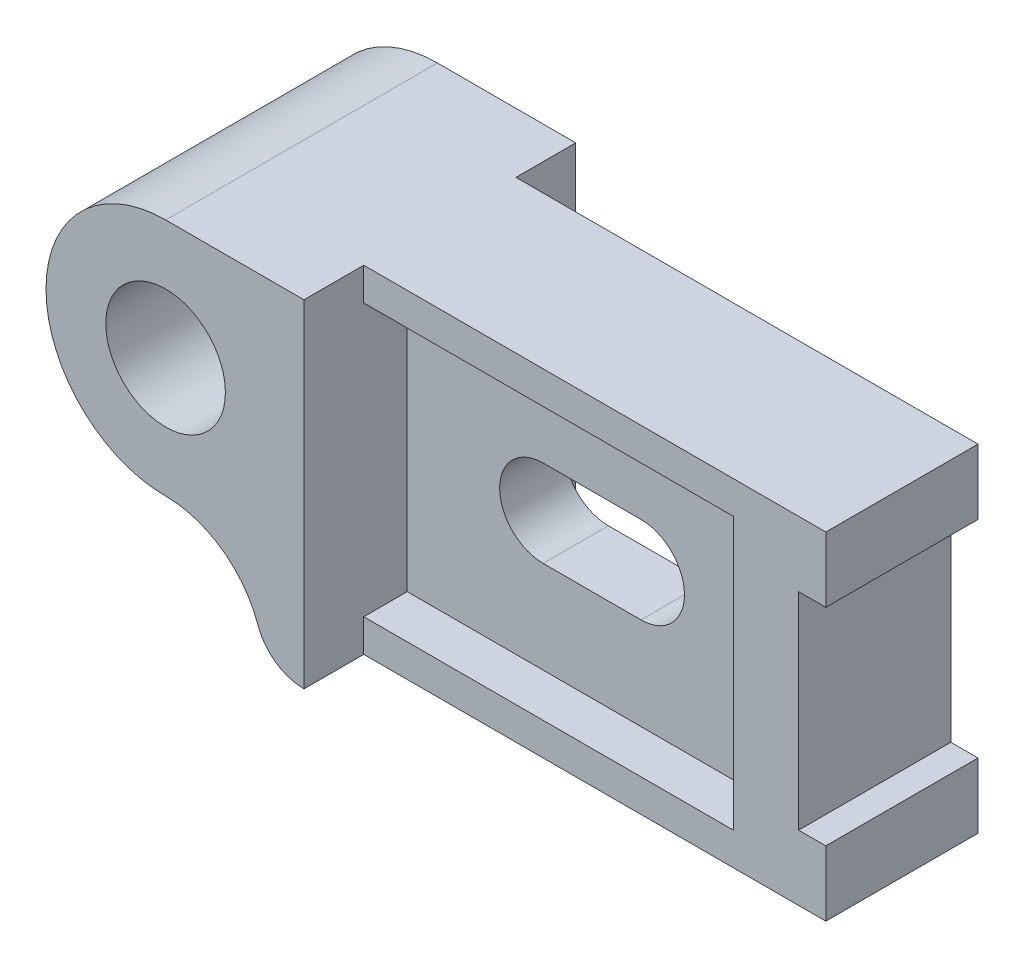
ISO-10303-21;
HEADER;
FILE_DESCRIPTION(('STEP AP214'),'2;1');
FILE_NAME('part.step','',(''),(''),'','','');
FILE_SCHEMA(('AUTOMOTIVE_DESIGN { 1 0 10303 214 1 1 1 1 }'));
ENDSEC;
DATA;
#1=APPLICATION_CONTEXT('core data for automotive mechanical design processes');
#2=APPLICATION_PROTOCOL_DEFINITION('international standard','automotive_design',2000,#1);
#3=PRODUCT_CONTEXT('',#1,'mechanical');
#4=PRODUCT('Part','Part','',(#3));
#5=PRODUCT_RELATED_PRODUCT_CATEGORY('part','',(#4));
#6=PRODUCT_DEFINITION_FORMATION('','',#4);
#7=PRODUCT_DEFINITION_CONTEXT('part definition',#1,'design');
#8=PRODUCT_DEFINITION('design','',#6,#7);
#9=PRODUCT_DEFINITION_SHAPE('','',#8);
#10=(LENGTH_UNIT() NAMED_UNIT(*) SI_UNIT(.MILLI.,.METRE.));
#11=(NAMED_UNIT(*) PLANE_ANGLE_UNIT() SI_UNIT($,.RADIAN.));
#12=(NAMED_UNIT(*) SI_UNIT($,.STERADIAN.) SOLID_ANGLE_UNIT());
#13=UNCERTAINTY_MEASURE_WITH_UNIT(LENGTH_MEASURE(1.E-05),#10,'distance_accuracy_value','');
#14=(GEOMETRIC_REPRESENTATION_CONTEXT(3) GLOBAL_UNCERTAINTY_ASSIGNED_CONTEXT((#13)) GLOBAL_UNIT_ASSIGNED_CONTEXT((#10,
#11,#12)) REPRESENTATION_CONTEXT('',''));
#15=CARTESIAN_POINT('',(0.,0.,0.));
#16=DIRECTION('',(0.,0.,1.));
#17=DIRECTION('',(1.,0.,0.));
#18=AXIS2_PLACEMENT_3D('',#15,#16,#17);
#19=CARTESIAN_POINT('',(93.4536598156302,16.,-19.));
#20=DIRECTION('',(0.,0.,-1.));
#21=DIRECTION('',(0.,1.,0.));
#22=AXIS2_PLACEMENT_3D('',#19,#20,#21);
#23=PLANE('',#22);
#24=DIRECTION('',(0.,-1.,0.));
#25=VECTOR('',#24,1.);
#26=CARTESIAN_POINT('',(25.4536598156302,16.,-19.));
#27=LINE('',#26,#25);
#28=CARTESIAN_POINT('',(25.4536598156302,16.,-19.));
#29=VERTEX_POINT('',#28);
#30=CARTESIAN_POINT('',(25.4536598156302,-34.,-19.));
#31=VERTEX_POINT('',#30);
#32=EDGE_CURVE('E270',#29,#31,#27,.T.);
#33=ORIENTED_EDGE('',*,*,#32,.T.);
#34=DIRECTION('',(-1.,0.,0.));
#35=VECTOR('',#34,1.);
#36=CARTESIAN_POINT('',(93.4536598156302,-34.,-19.));
#37=LINE('',#36,#35);
#38=CARTESIAN_POINT('',(93.4536598156302,-34.,-19.));
#39=VERTEX_POINT('',#38);
#40=EDGE_CURVE('E291',#39,#31,#37,.T.);
#41=ORIENTED_EDGE('',*,*,#40,.F.);
#42=DIRECTION('',(0.,-1.,0.));
#43=VECTOR('',#42,1.);
#44=CARTESIAN_POINT('',(93.4536598156302,16.,-19.));
#45=LINE('',#44,#43);
#46=CARTESIAN_POINT('',(93.4536598156302,16.,-19.));
#47=VERTEX_POINT('',#46);
#48=EDGE_CURVE('E275',#47,#39,#45,.T.);
#49=ORIENTED_EDGE('',*,*,#48,.F.);
#50=DIRECTION('',(-1.,0.,0.));
#51=VECTOR('',#50,1.);
#52=CARTESIAN_POINT('',(93.4536598156302,16.,-19.));
#53=LINE('',#52,#51);
#54=EDGE_CURVE('E282',#47,#29,#53,.T.);
#55=ORIENTED_EDGE('',*,*,#54,.T.);
#56=EDGE_LOOP('',(#33,#41,#49,#55));
#57=FACE_BOUND('',#56,.T.);
#58=CARTESIAN_POINT('',(50.4536598156302,-9.,-19.));
#59=DIRECTION('',(0.,0.,1.));
#60=DIRECTION('',(1.,0.,0.));
#61=AXIS2_PLACEMENT_3D('',#58,#59,#60);
#62=CIRCLE('',#61,8.);
#63=CARTESIAN_POINT('',(50.4536598156302,-0.999999999999998,-19.));
#64=VERTEX_POINT('',#63);
#65=CARTESIAN_POINT('',(50.4536598156302,-17.,-19.));
#66=VERTEX_POINT('',#65);
#67=EDGE_CURVE('E210',#64,#66,#62,.T.);
#68=ORIENTED_EDGE('',*,*,#67,.F.);
#69=DIRECTION('',(-1.,0.,0.));
#70=VECTOR('',#69,1.);
#71=CARTESIAN_POINT('',(50.4536598156302,-0.999999999999998,-19.));
#72=LINE('',#71,#70);
#73=CARTESIAN_POINT('',(68.4536598156302,-0.999999999999998,-19.));
#74=VERTEX_POINT('',#73);
#75=EDGE_CURVE('E207',#74,#64,#72,.T.);
#76=ORIENTED_EDGE('',*,*,#75,.F.);
#77=CARTESIAN_POINT('',(68.4536598156302,-9.,-19.));
#78=DIRECTION('',(0.,0.,1.));
#79=DIRECTION('',(1.,0.,0.));
#80=AXIS2_PLACEMENT_3D('',#77,#78,#79);
#81=CIRCLE('',#80,8.);
#82=CARTESIAN_POINT('',(68.4536598156302,-17.,-19.));
#83=VERTEX_POINT('',#82);
#84=EDGE_CURVE('E48',#83,#74,#81,.T.);
#85=ORIENTED_EDGE('',*,*,#84,.F.);
#86=DIRECTION('',(1.,0.,0.));
#87=VECTOR('',#86,1.);
#88=CARTESIAN_POINT('',(50.4536598156302,-17.,-19.));
#89=LINE('',#88,#87);
#90=EDGE_CURVE('E203',#66,#83,#89,.T.);
#91=ORIENTED_EDGE('',*,*,#90,.F.);
#92=EDGE_LOOP('',(#68,#76,#85,#91));
#93=FACE_BOUND('',#92,.T.);
#94=ADVANCED_FACE('F33',(#57,#93),#23,.F.);
#95=CARTESIAN_POINT('',(105.45365981563,0.,0.));
#96=DIRECTION('',(1.,0.,0.));
#97=DIRECTION('',(0.,0.,-1.));
#98=AXIS2_PLACEMENT_3D('',#95,#96,#97);
#99=PLANE('',#98);
#100=DIRECTION('',(0.,-1.,0.));
#101=VECTOR('',#100,1.);
#102=CARTESIAN_POINT('',(105.45365981563,22.,-11.));
#103=LINE('',#102,#101);
#104=CARTESIAN_POINT('',(105.45365981563,10.,-11.));
#105=VERTEX_POINT('',#104);
#106=CARTESIAN_POINT('',(105.45365981563,-28.,-11.));
#107=VERTEX_POINT('',#106);
#108=EDGE_CURVE('E264',#105,#107,#103,.T.);
#109=ORIENTED_EDGE('',*,*,#108,.T.);
#110=DIRECTION('',(0.,0.,1.));
#111=VECTOR('',#110,1.);
#112=CARTESIAN_POINT('',(105.45365981563,-28.,-11.));
#113=LINE('',#112,#111);
#114=CARTESIAN_POINT('',(105.45365981563,-28.,-39.));
#115=VERTEX_POINT('',#114);
#116=EDGE_CURVE('E223',#115,#107,#113,.T.);
#117=ORIENTED_EDGE('',*,*,#116,.F.);
#118=DIRECTION('',(0.,1.,0.));
#119=VECTOR('',#118,1.);
#120=CARTESIAN_POINT('',(105.45365981563,22.,-39.));
#121=LINE('',#120,#119);
#122=CARTESIAN_POINT('',(105.45365981563,10.,-39.));
#123=VERTEX_POINT('',#122);
#124=EDGE_CURVE('E267',#115,#123,#121,.T.);
#125=ORIENTED_EDGE('',*,*,#124,.T.);
#126=DIRECTION('',(0.,0.,-1.));
#127=VECTOR('',#126,1.);
#128=CARTESIAN_POINT('',(105.45365981563,10.,-11.));
#129=LINE('',#128,#127);
#130=EDGE_CURVE('E243',#105,#123,#129,.T.);
#131=ORIENTED_EDGE('',*,*,#130,.F.);
#132=EDGE_LOOP('',(#109,#117,#125,#131));
#133=FACE_BOUND('',#132,.T.);
#134=ADVANCED_FACE('F414',(#133),#99,.T.);
#135=CARTESIAN_POINT('',(25.4536598156302,22.,-50.));
#136=DIRECTION('',(1.,0.,0.));
#137=DIRECTION('',(0.,0.,-1.));
#138=AXIS2_PLACEMENT_3D('',#135,#136,#137);
#139=PLANE('',#138);
#140=DIRECTION('',(0.,0.,1.));
#141=VECTOR('',#140,1.);
#142=CARTESIAN_POINT('',(25.4536598156302,-34.,-11.));
#143=LINE('',#142,#141);
#144=CARTESIAN_POINT('',(25.4536598156302,-34.,-11.));
#145=VERTEX_POINT('',#144);
#146=EDGE_CURVE('E305',#31,#145,#143,.T.);
#147=ORIENTED_EDGE('',*,*,#146,.F.);
#148=ORIENTED_EDGE('',*,*,#32,.F.);
#149=DIRECTION('',(0.,0.,-1.));
#150=VECTOR('',#149,1.);
#151=CARTESIAN_POINT('',(25.4536598156302,16.,-11.));
#152=LINE('',#151,#150);
#153=CARTESIAN_POINT('',(25.4536598156302,16.,-11.));
#154=VERTEX_POINT('',#153);
#155=EDGE_CURVE('E329',#154,#29,#152,.T.);
#156=ORIENTED_EDGE('',*,*,#155,.F.);
#157=DIRECTION('',(0.,-1.,0.));
#158=VECTOR('',#157,1.);
#159=CARTESIAN_POINT('',(25.4536598156302,22.,-11.));
#160=LINE('',#159,#158);
#161=CARTESIAN_POINT('',(25.4536598156302,22.,-11.));
#162=VERTEX_POINT('',#161);
#163=EDGE_CURVE('E320',#162,#154,#160,.T.);
#164=ORIENTED_EDGE('',*,*,#163,.F.);
#165=DIRECTION('',(0.,0.,1.));
#166=VECTOR('',#165,1.);
#167=CARTESIAN_POINT('',(25.4536598156302,22.,-50.));
#168=LINE('',#167,#166);
#169=CARTESIAN_POINT('',(25.4536598156302,22.,0.));
#170=VERTEX_POINT('',#169);
#171=EDGE_CURVE('E387',#162,#170,#168,.T.);
#172=ORIENTED_EDGE('',*,*,#171,.T.);
#173=DIRECTION('',(0.,1.,0.));
#174=VECTOR('',#173,1.);
#175=CARTESIAN_POINT('',(25.4536598156302,22.,0.));
#176=LINE('',#175,#174);
#177=CARTESIAN_POINT('',(25.4536598156302,-40.,0.));
#178=VERTEX_POINT('',#177);
#179=EDGE_CURVE('E378',#178,#170,#176,.T.);
#180=ORIENTED_EDGE('',*,*,#179,.F.);
#181=DIRECTION('',(0.,0.,1.));
#182=VECTOR('',#181,1.);
#183=CARTESIAN_POINT('',(25.4536598156302,-40.,-50.));
#184=LINE('',#183,#182);
#185=CARTESIAN_POINT('',(25.4536598156302,-40.,-11.));
#186=VERTEX_POINT('',#185);
#187=EDGE_CURVE('E391',#186,#178,#184,.T.);
#188=ORIENTED_EDGE('',*,*,#187,.F.);
#189=DIRECTION('',(0.,-1.,0.));
#190=VECTOR('',#189,1.);
#191=CARTESIAN_POINT('',(25.4536598156302,-40.,-11.));
#192=LINE('',#191,#190);
#193=EDGE_CURVE('E294',#145,#186,#192,.T.);
#194=ORIENTED_EDGE('',*,*,#193,.F.);
#195=EDGE_LOOP('',(#147,#148,#156,#164,#172,#180,#188,#194));
#196=FACE_BOUND('',#195,.T.);
#197=ADVANCED_FACE('F420',(#196),#139,.T.);
#198=CARTESIAN_POINT('',(25.4536598156302,16.,-31.));
#199=VERTEX_POINT('',#198);
#200=CARTESIAN_POINT('',(25.4536598156302,16.,-39.));
#201=VERTEX_POINT('',#200);
#202=EDGE_CURVE('E328',#199,#201,#152,.T.);
#203=ORIENTED_EDGE('',*,*,#202,.F.);
#204=DIRECTION('',(0.,1.,0.));
#205=VECTOR('',#204,1.);
#206=CARTESIAN_POINT('',(25.4536598156302,16.,-31.));
#207=LINE('',#206,#205);
#208=CARTESIAN_POINT('',(25.4536598156302,-34.,-31.));
#209=VERTEX_POINT('',#208);
#210=EDGE_CURVE('E279',#209,#199,#207,.T.);
#211=ORIENTED_EDGE('',*,*,#210,.F.);
#212=CARTESIAN_POINT('',(25.4536598156302,-34.,-39.));
#213=VERTEX_POINT('',#212);
#214=EDGE_CURVE('E306',#213,#209,#143,.T.);
#215=ORIENTED_EDGE('',*,*,#214,.F.);
#216=DIRECTION('',(0.,1.,0.));
#217=VECTOR('',#216,1.);
#218=CARTESIAN_POINT('',(25.4536598156302,-40.,-39.));
#219=LINE('',#218,#217);
#220=CARTESIAN_POINT('',(25.4536598156302,-40.,-39.));
#221=VERTEX_POINT('',#220);
#222=EDGE_CURVE('E303',#221,#213,#219,.T.);
#223=ORIENTED_EDGE('',*,*,#222,.F.);
#224=CARTESIAN_POINT('',(25.4536598156302,-40.,-50.));
#225=VERTEX_POINT('',#224);
#226=EDGE_CURVE('E388',#225,#221,#184,.T.);
#227=ORIENTED_EDGE('',*,*,#226,.F.);
#228=DIRECTION('',(0.,1.,0.));
#229=VECTOR('',#228,1.);
#230=CARTESIAN_POINT('',(25.4536598156302,22.,-50.));
#231=LINE('',#230,#229);
#232=CARTESIAN_POINT('',(25.4536598156302,22.,-50.));
#233=VERTEX_POINT('',#232);
#234=EDGE_CURVE('E363',#225,#233,#231,.T.);
#235=ORIENTED_EDGE('',*,*,#234,.T.);
#236=CARTESIAN_POINT('',(25.4536598156302,22.,-39.));
#237=VERTEX_POINT('',#236);
#238=EDGE_CURVE('E385',#233,#237,#168,.T.);
#239=ORIENTED_EDGE('',*,*,#238,.T.);
#240=DIRECTION('',(0.,1.,0.));
#241=VECTOR('',#240,1.);
#242=CARTESIAN_POINT('',(25.4536598156302,22.,-39.));
#243=LINE('',#242,#241);
#244=EDGE_CURVE('E332',#201,#237,#243,.T.);
#245=ORIENTED_EDGE('',*,*,#244,.F.);
#246=EDGE_LOOP('',(#203,#211,#215,#223,#227,#235,#239,#245));
#247=FACE_BOUND('',#246,.T.);
#248=ADVANCED_FACE('F444',(#247),#139,.T.);
#249=CARTESIAN_POINT('',(93.4536598156302,16.,-11.));
#250=DIRECTION('',(0.,1.,0.));
#251=DIRECTION('',(0.,0.,1.));
#252=AXIS2_PLACEMENT_3D('',#249,#250,#251);
#253=PLANE('',#252);
#254=ORIENTED_EDGE('',*,*,#54,.F.);
#255=DIRECTION('',(0.,0.,-1.));
#256=VECTOR('',#255,1.);
#257=CARTESIAN_POINT('',(93.4536598156302,16.,-11.));
#258=LINE('',#257,#256);
#259=CARTESIAN_POINT('',(93.4536598156302,16.,-11.));
#260=VERTEX_POINT('',#259);
#261=EDGE_CURVE('E321',#260,#47,#258,.T.);
#262=ORIENTED_EDGE('',*,*,#261,.F.);
#263=DIRECTION('',(-1.,0.,0.));
#264=VECTOR('',#263,1.);
#265=CARTESIAN_POINT('',(93.4536598156302,16.,-11.));
#266=LINE('',#265,#264);
#267=EDGE_CURVE('E343',#260,#154,#266,.T.);
#268=ORIENTED_EDGE('',*,*,#267,.T.);
#269=ORIENTED_EDGE('',*,*,#155,.T.);
#270=EDGE_LOOP('',(#254,#262,#268,#269));
#271=FACE_BOUND('',#270,.T.);
#272=ADVANCED_FACE('F441',(#271),#253,.F.);
#273=DIRECTION('',(-1.,0.,0.));
#274=VECTOR('',#273,1.);
#275=CARTESIAN_POINT('',(93.4536598156302,16.,-31.));
#276=LINE('',#275,#274);
#277=CARTESIAN_POINT('',(93.4536598156302,16.,-31.));
#278=VERTEX_POINT('',#277);
#279=EDGE_CURVE('E286',#278,#199,#276,.T.);
#280=ORIENTED_EDGE('',*,*,#279,.T.);
#281=ORIENTED_EDGE('',*,*,#202,.T.);
#282=DIRECTION('',(-1.,0.,0.));
#283=VECTOR('',#282,1.);
#284=CARTESIAN_POINT('',(93.4536598156302,16.,-39.));
#285=LINE('',#284,#283);
#286=CARTESIAN_POINT('',(93.4536598156302,16.,-39.));
#287=VERTEX_POINT('',#286);
#288=EDGE_CURVE('E340',#287,#201,#285,.T.);
#289=ORIENTED_EDGE('',*,*,#288,.F.);
#290=EDGE_CURVE('E325',#278,#287,#258,.T.);
#291=ORIENTED_EDGE('',*,*,#290,.F.);
#292=EDGE_LOOP('',(#280,#281,#289,#291));
#293=FACE_BOUND('',#292,.T.);
#294=ADVANCED_FACE('F430',(#293),#253,.F.);
#295=CARTESIAN_POINT('',(93.4536598156302,-34.,-11.));
#296=DIRECTION('',(0.,-1.,0.));
#297=DIRECTION('',(0.,0.,-1.));
#298=AXIS2_PLACEMENT_3D('',#295,#296,#297);
#299=PLANE('',#298);
#300=ORIENTED_EDGE('',*,*,#40,.T.);
#301=ORIENTED_EDGE('',*,*,#146,.T.);
#302=DIRECTION('',(-1.,0.,0.));
#303=VECTOR('',#302,1.);
#304=CARTESIAN_POINT('',(93.4536598156302,-34.,-11.));
#305=LINE('',#304,#303);
#306=CARTESIAN_POINT('',(93.4536598156302,-34.,-11.));
#307=VERTEX_POINT('',#306);
#308=EDGE_CURVE('E298',#307,#145,#305,.T.);
#309=ORIENTED_EDGE('',*,*,#308,.F.);
#310=DIRECTION('',(0.,0.,1.));
#311=VECTOR('',#310,1.);
#312=CARTESIAN_POINT('',(93.4536598156302,-34.,-11.));
#313=LINE('',#312,#311);
#314=EDGE_CURVE('E299',#39,#307,#313,.T.);
#315=ORIENTED_EDGE('',*,*,#314,.F.);
#316=EDGE_LOOP('',(#300,#301,#309,#315));
#317=FACE_BOUND('',#316,.T.);
#318=ADVANCED_FACE('F426',(#317),#299,.F.);
#319=DIRECTION('',(-1.,0.,0.));
#320=VECTOR('',#319,1.);
#321=CARTESIAN_POINT('',(93.4536598156302,-34.,-31.));
#322=LINE('',#321,#320);
#323=CARTESIAN_POINT('',(93.4536598156302,-34.,-31.));
#324=VERTEX_POINT('',#323);
#325=EDGE_CURVE('E289',#324,#209,#322,.T.);
#326=ORIENTED_EDGE('',*,*,#325,.F.);
#327=CARTESIAN_POINT('',(93.4536598156302,-34.,-39.));
#328=VERTEX_POINT('',#327);
#329=EDGE_CURVE('E295',#328,#324,#313,.T.);
#330=ORIENTED_EDGE('',*,*,#329,.F.);
#331=DIRECTION('',(-1.,0.,0.));
#332=VECTOR('',#331,1.);
#333=CARTESIAN_POINT('',(93.4536598156302,-34.,-39.));
#334=LINE('',#333,#332);
#335=EDGE_CURVE('E311',#328,#213,#334,.T.);
#336=ORIENTED_EDGE('',*,*,#335,.T.);
#337=ORIENTED_EDGE('',*,*,#214,.T.);
#338=EDGE_LOOP('',(#326,#330,#336,#337));
#339=FACE_BOUND('',#338,.T.);
#340=ADVANCED_FACE('F429',(#339),#299,.F.);
#341=CARTESIAN_POINT('',(0.,0.,-50.));
#342=DIRECTION('',(0.,0.,1.));
#343=DIRECTION('',(1.,0.,0.));
#344=AXIS2_PLACEMENT_3D('',#341,#342,#343);
#345=CYLINDRICAL_SURFACE('',#344,22.);
#346=CARTESIAN_POINT('',(0.,0.,0.));
#347=DIRECTION('',(0.,0.,1.));
#348=DIRECTION('',(1.,0.,0.));
#349=AXIS2_PLACEMENT_3D('',#346,#347,#348);
#350=CIRCLE('',#349,22.);
#351=CARTESIAN_POINT('',(0.,22.,0.));
#352=VERTEX_POINT('',#351);
#353=CARTESIAN_POINT('',(0.,-22.,0.));
#354=VERTEX_POINT('',#353);
#355=EDGE_CURVE('E350',#352,#354,#350,.T.);
#356=ORIENTED_EDGE('',*,*,#355,.F.);
#357=DIRECTION('',(0.,0.,1.));
#358=VECTOR('',#357,1.);
#359=CARTESIAN_POINT('',(0.,22.,-50.));
#360=LINE('',#359,#358);
#361=CARTESIAN_POINT('',(0.,22.,-50.));
#362=VERTEX_POINT('',#361);
#363=EDGE_CURVE('E383',#362,#352,#360,.T.);
#364=ORIENTED_EDGE('',*,*,#363,.F.);
#365=CARTESIAN_POINT('',(0.,0.,-50.));
#366=DIRECTION('',(0.,0.,1.));
#367=DIRECTION('',(1.,0.,0.));
#368=AXIS2_PLACEMENT_3D('',#365,#366,#367);
#369=CIRCLE('',#368,22.);
#370=CARTESIAN_POINT('',(0.,-22.,-50.));
#371=VERTEX_POINT('',#370);
#372=EDGE_CURVE('E353',#362,#371,#369,.T.);
#373=ORIENTED_EDGE('',*,*,#372,.T.);
#374=DIRECTION('',(0.,0.,1.));
#375=VECTOR('',#374,1.);
#376=CARTESIAN_POINT('',(0.,-22.,-50.));
#377=LINE('',#376,#375);
#378=EDGE_CURVE('E369',#371,#354,#377,.T.);
#379=ORIENTED_EDGE('',*,*,#378,.T.);
#380=EDGE_LOOP('',(#356,#364,#373,#379));
#381=FACE_BOUND('',#380,.T.);
#382=ADVANCED_FACE('F35',(#381),#345,.T.);
#383=CARTESIAN_POINT('',(0.,22.,-50.));
#384=DIRECTION('',(0.,1.,0.));
#385=DIRECTION('',(0.,0.,1.));
#386=AXIS2_PLACEMENT_3D('',#383,#384,#385);
#387=PLANE('',#386);
#388=DIRECTION('',(-1.,0.,0.));
#389=VECTOR('',#388,1.);
#390=CARTESIAN_POINT('',(0.,22.,0.));
#391=LINE('',#390,#389);
#392=EDGE_CURVE('E357',#170,#352,#391,.T.);
#393=ORIENTED_EDGE('',*,*,#392,.F.);
#394=ORIENTED_EDGE('',*,*,#171,.F.);
#395=DIRECTION('',(-1.,0.,0.));
#396=VECTOR('',#395,1.);
#397=CARTESIAN_POINT('',(93.4536598156302,22.,-11.));
#398=LINE('',#397,#396);
#399=CARTESIAN_POINT('',(110.45365981563,22.,-11.));
#400=VERTEX_POINT('',#399);
#401=EDGE_CURVE('E324',#400,#162,#398,.T.);
#402=ORIENTED_EDGE('',*,*,#401,.F.);
#403=DIRECTION('',(0.,0.,1.));
#404=VECTOR('',#403,1.);
#405=CARTESIAN_POINT('',(110.45365981563,22.,-11.));
#406=LINE('',#405,#404);
#407=CARTESIAN_POINT('',(110.45365981563,22.,-39.));
#408=VERTEX_POINT('',#407);
#409=EDGE_CURVE('E252',#408,#400,#406,.T.);
#410=ORIENTED_EDGE('',*,*,#409,.F.);
#411=DIRECTION('',(-1.,0.,0.));
#412=VECTOR('',#411,1.);
#413=CARTESIAN_POINT('',(93.4536598156302,22.,-39.));
#414=LINE('',#413,#412);
#415=EDGE_CURVE('E337',#408,#237,#414,.T.);
#416=ORIENTED_EDGE('',*,*,#415,.T.);
#417=ORIENTED_EDGE('',*,*,#238,.F.);
#418=DIRECTION('',(-1.,0.,0.));
#419=VECTOR('',#418,1.);
#420=CARTESIAN_POINT('',(0.,22.,-50.));
#421=LINE('',#420,#419);
#422=EDGE_CURVE('E366',#233,#362,#421,.T.);
#423=ORIENTED_EDGE('',*,*,#422,.T.);
#424=ORIENTED_EDGE('',*,*,#363,.T.);
#425=EDGE_LOOP('',(#393,#394,#402,#410,#416,#417,#423,#424));
#426=FACE_BOUND('',#425,.T.);
#427=ADVANCED_FACE('F462',(#426),#387,.T.);
#428=CARTESIAN_POINT('',(25.4536598156302,-31.,-50.));
#429=DIRECTION('',(0.,0.,1.));
#430=DIRECTION('',(1.,0.,0.));
#431=AXIS2_PLACEMENT_3D('',#428,#429,#430);
#432=CYLINDRICAL_SURFACE('',#431,9.);
#433=CARTESIAN_POINT('',(25.4536598156302,-31.,0.));
#434=DIRECTION('',(0.,0.,1.));
#435=DIRECTION('',(-1.,0.,0.));
#436=AXIS2_PLACEMENT_3D('',#433,#434,#435);
#437=CIRCLE('',#436,9.);
#438=CARTESIAN_POINT('',(16.9173505678596,-33.8515652590159,0.));
#439=VERTEX_POINT('',#438);
#440=EDGE_CURVE('E375',#439,#178,#437,.T.);
#441=ORIENTED_EDGE('',*,*,#440,.F.);
#442=DIRECTION('',(0.,0.,1.));
#443=VECTOR('',#442,1.);
#444=CARTESIAN_POINT('',(16.9173505678596,-33.8515652590159,-50.));
#445=LINE('',#444,#443);
#446=CARTESIAN_POINT('',(16.9173505678596,-33.8515652590159,-50.));
#447=VERTEX_POINT('',#446);
#448=EDGE_CURVE('E392',#447,#439,#445,.T.);
#449=ORIENTED_EDGE('',*,*,#448,.F.);
#450=CARTESIAN_POINT('',(25.4536598156302,-31.,-50.));
#451=DIRECTION('',(0.,0.,1.));
#452=DIRECTION('',(-1.,0.,0.));
#453=AXIS2_PLACEMENT_3D('',#450,#451,#452);
#454=CIRCLE('',#453,9.);
#455=EDGE_CURVE('E360',#447,#225,#454,.T.);
#456=ORIENTED_EDGE('',*,*,#455,.T.);
#457=ORIENTED_EDGE('',*,*,#226,.T.);
#458=DIRECTION('',(0.,0.,-1.));
#459=VECTOR('',#458,1.);
#460=CARTESIAN_POINT('',(25.4536598156302,-40.,-11.));
#461=LINE('',#460,#459);
#462=EDGE_CURVE('E301',#186,#221,#461,.T.);
#463=ORIENTED_EDGE('',*,*,#462,.F.);
#464=ORIENTED_EDGE('',*,*,#187,.T.);
#465=EDGE_LOOP('',(#441,#449,#456,#457,#463,#464));
#466=FACE_BOUND('',#465,.T.);
#467=ADVANCED_FACE('F465',(#466),#432,.T.);
#468=CARTESIAN_POINT('',(0.,-40.,-50.));
#469=DIRECTION('',(0.,0.,1.));
#470=DIRECTION('',(1.,0.,0.));
#471=AXIS2_PLACEMENT_3D('',#468,#469,#470);
#472=CYLINDRICAL_SURFACE('',#471,18.);
#473=CARTESIAN_POINT('',(0.,-40.,0.));
#474=DIRECTION('',(0.,0.,-1.));
#475=DIRECTION('',(-1.,0.,0.));
#476=AXIS2_PLACEMENT_3D('',#473,#474,#475);
#477=CIRCLE('',#476,18.);
#478=EDGE_CURVE('E372',#354,#439,#477,.T.);
#479=ORIENTED_EDGE('',*,*,#478,.F.);
#480=ORIENTED_EDGE('',*,*,#378,.F.);
#481=CARTESIAN_POINT('',(0.,-40.,-50.));
#482=DIRECTION('',(0.,0.,-1.));
#483=DIRECTION('',(-1.,0.,0.));
#484=AXIS2_PLACEMENT_3D('',#481,#482,#483);
#485=CIRCLE('',#484,18.);
#486=EDGE_CURVE('E356',#371,#447,#485,.T.);
#487=ORIENTED_EDGE('',*,*,#486,.T.);
#488=ORIENTED_EDGE('',*,*,#448,.T.);
#489=EDGE_LOOP('',(#479,#480,#487,#488));
#490=FACE_BOUND('',#489,.T.);
#491=ADVANCED_FACE('F457',(#490),#472,.F.);
#492=CARTESIAN_POINT('',(0.,0.,-50.));
#493=DIRECTION('',(0.,0.,1.));
#494=DIRECTION('',(1.,0.,0.));
#495=AXIS2_PLACEMENT_3D('',#492,#493,#494);
#496=PLANE('',#495);
#497=CARTESIAN_POINT('',(0.,0.,-50.));
#498=DIRECTION('',(0.,0.,1.));
#499=DIRECTION('',(1.,0.,0.));
#500=AXIS2_PLACEMENT_3D('',#497,#498,#499);
#501=CIRCLE('',#500,11.);
#502=CARTESIAN_POINT('',(11.,0.,-50.));
#503=VERTEX_POINT('',#502);
#504=EDGE_CURVE('E347',#503,#503,#501,.T.);
#505=ORIENTED_EDGE('',*,*,#504,.T.);
#506=EDGE_LOOP('',(#505));
#507=FACE_BOUND('',#506,.T.);
#508=ORIENTED_EDGE('',*,*,#372,.F.);
#509=ORIENTED_EDGE('',*,*,#422,.F.);
#510=ORIENTED_EDGE('',*,*,#234,.F.);
#511=ORIENTED_EDGE('',*,*,#455,.F.);
#512=ORIENTED_EDGE('',*,*,#486,.F.);
#513=EDGE_LOOP('',(#508,#509,#510,#511,#512));
#514=FACE_BOUND('',#513,.T.);
#515=ADVANCED_FACE('F454',(#507,#514),#496,.F.);
#516=CARTESIAN_POINT('',(0.,0.,0.));
#517=DIRECTION('',(0.,0.,1.));
#518=DIRECTION('',(1.,0.,0.));
#519=AXIS2_PLACEMENT_3D('',#516,#517,#518);
#520=PLANE('',#519);
#521=CARTESIAN_POINT('',(0.,0.,0.));
#522=DIRECTION('',(0.,0.,1.));
#523=DIRECTION('',(1.,0.,0.));
#524=AXIS2_PLACEMENT_3D('',#521,#522,#523);
#525=CIRCLE('',#524,11.);
#526=CARTESIAN_POINT('',(11.,0.,0.));
#527=VERTEX_POINT('',#526);
#528=EDGE_CURVE('E346',#527,#527,#525,.T.);
#529=ORIENTED_EDGE('',*,*,#528,.F.);
#530=EDGE_LOOP('',(#529));
#531=FACE_BOUND('',#530,.T.);
#532=ORIENTED_EDGE('',*,*,#355,.T.);
#533=ORIENTED_EDGE('',*,*,#478,.T.);
#534=ORIENTED_EDGE('',*,*,#440,.T.);
#535=ORIENTED_EDGE('',*,*,#179,.T.);
#536=ORIENTED_EDGE('',*,*,#392,.T.);
#537=EDGE_LOOP('',(#532,#533,#534,#535,#536));
#538=FACE_BOUND('',#537,.T.);
#539=ADVANCED_FACE('F452',(#531,#538),#520,.T.);
#540=CARTESIAN_POINT('',(0.,0.,-50.));
#541=DIRECTION('',(0.,0.,1.));
#542=DIRECTION('',(1.,0.,0.));
#543=AXIS2_PLACEMENT_3D('',#540,#541,#542);
#544=CYLINDRICAL_SURFACE('',#543,11.);
#545=ORIENTED_EDGE('',*,*,#504,.F.);
#546=EDGE_LOOP('',(#545));
#547=FACE_BOUND('',#546,.T.);
#548=ORIENTED_EDGE('',*,*,#528,.T.);
#549=EDGE_LOOP('',(#548));
#550=FACE_BOUND('',#549,.T.);
#551=ADVANCED_FACE('F448',(#547,#550),#544,.F.);
#552=CARTESIAN_POINT('',(93.4536598156302,22.,-11.));
#553=DIRECTION('',(0.,0.,-1.));
#554=DIRECTION('',(0.,1.,0.));
#555=AXIS2_PLACEMENT_3D('',#552,#553,#554);
#556=PLANE('',#555);
#557=ORIENTED_EDGE('',*,*,#163,.T.);
#558=ORIENTED_EDGE('',*,*,#267,.F.);
#559=DIRECTION('',(0.,-1.,0.));
#560=VECTOR('',#559,1.);
#561=CARTESIAN_POINT('',(93.4536598156302,22.,-11.));
#562=LINE('',#561,#560);
#563=EDGE_CURVE('E263',#260,#307,#562,.T.);
#564=ORIENTED_EDGE('',*,*,#563,.T.);
#565=ORIENTED_EDGE('',*,*,#308,.T.);
#566=ORIENTED_EDGE('',*,*,#193,.T.);
#567=DIRECTION('',(-1.,0.,0.));
#568=VECTOR('',#567,1.);
#569=CARTESIAN_POINT('',(93.4536598156302,-40.,-11.));
#570=LINE('',#569,#568);
#571=CARTESIAN_POINT('',(110.45365981563,-40.,-11.));
#572=VERTEX_POINT('',#571);
#573=EDGE_CURVE('E317',#572,#186,#570,.T.);
#574=ORIENTED_EDGE('',*,*,#573,.F.);
#575=DIRECTION('',(0.,-1.,0.));
#576=VECTOR('',#575,1.);
#577=CARTESIAN_POINT('',(110.45365981563,-40.,-11.));
#578=LINE('',#577,#576);
#579=CARTESIAN_POINT('',(110.45365981563,-28.,-11.));
#580=VERTEX_POINT('',#579);
#581=EDGE_CURVE('E227',#580,#572,#578,.T.);
#582=ORIENTED_EDGE('',*,*,#581,.F.);
#583=DIRECTION('',(-1.,0.,0.));
#584=VECTOR('',#583,1.);
#585=CARTESIAN_POINT('',(110.45365981563,-28.,-11.));
#586=LINE('',#585,#584);
#587=EDGE_CURVE('E237',#580,#107,#586,.T.);
#588=ORIENTED_EDGE('',*,*,#587,.T.);
#589=ORIENTED_EDGE('',*,*,#108,.F.);
#590=DIRECTION('',(-1.,0.,0.));
#591=VECTOR('',#590,1.);
#592=CARTESIAN_POINT('',(110.45365981563,10.,-11.));
#593=LINE('',#592,#591);
#594=CARTESIAN_POINT('',(110.45365981563,10.,-11.));
#595=VERTEX_POINT('',#594);
#596=EDGE_CURVE('E260',#595,#105,#593,.T.);
#597=ORIENTED_EDGE('',*,*,#596,.F.);
#598=DIRECTION('',(0.,-1.,0.));
#599=VECTOR('',#598,1.);
#600=CARTESIAN_POINT('',(110.45365981563,22.,-11.));
#601=LINE('',#600,#599);
#602=EDGE_CURVE('E244',#400,#595,#601,.T.);
#603=ORIENTED_EDGE('',*,*,#602,.F.);
#604=ORIENTED_EDGE('',*,*,#401,.T.);
#605=EDGE_LOOP('',(#557,#558,#564,#565,#566,#574,#582,#588,#589,#597,#603,#604));
#606=FACE_BOUND('',#605,.T.);
#607=ADVANCED_FACE('F439',(#606),#556,.F.);
#608=CARTESIAN_POINT('',(93.4536598156302,22.,-39.));
#609=DIRECTION('',(0.,0.,1.));
#610=DIRECTION('',(1.,0.,0.));
#611=AXIS2_PLACEMENT_3D('',#608,#609,#610);
#612=PLANE('',#611);
#613=ORIENTED_EDGE('',*,*,#244,.T.);
#614=ORIENTED_EDGE('',*,*,#415,.F.);
#615=DIRECTION('',(0.,1.,0.));
#616=VECTOR('',#615,1.);
#617=CARTESIAN_POINT('',(110.45365981563,22.,-39.));
#618=LINE('',#617,#616);
#619=CARTESIAN_POINT('',(110.45365981563,10.,-39.));
#620=VERTEX_POINT('',#619);
#621=EDGE_CURVE('E249',#620,#408,#618,.T.);
#622=ORIENTED_EDGE('',*,*,#621,.F.);
#623=DIRECTION('',(-1.,0.,0.));
#624=VECTOR('',#623,1.);
#625=CARTESIAN_POINT('',(110.45365981563,10.,-39.));
#626=LINE('',#625,#624);
#627=EDGE_CURVE('E255',#620,#123,#626,.T.);
#628=ORIENTED_EDGE('',*,*,#627,.T.);
#629=ORIENTED_EDGE('',*,*,#124,.F.);
#630=DIRECTION('',(-1.,0.,0.));
#631=VECTOR('',#630,1.);
#632=CARTESIAN_POINT('',(110.45365981563,-28.,-39.));
#633=LINE('',#632,#631);
#634=CARTESIAN_POINT('',(110.45365981563,-28.,-39.));
#635=VERTEX_POINT('',#634);
#636=EDGE_CURVE('E241',#635,#115,#633,.T.);
#637=ORIENTED_EDGE('',*,*,#636,.F.);
#638=DIRECTION('',(0.,1.,0.));
#639=VECTOR('',#638,1.);
#640=CARTESIAN_POINT('',(110.45365981563,-40.,-39.));
#641=LINE('',#640,#639);
#642=CARTESIAN_POINT('',(110.45365981563,-40.,-39.));
#643=VERTEX_POINT('',#642);
#644=EDGE_CURVE('E233',#643,#635,#641,.T.);
#645=ORIENTED_EDGE('',*,*,#644,.F.);
#646=DIRECTION('',(-1.,0.,0.));
#647=VECTOR('',#646,1.);
#648=CARTESIAN_POINT('',(93.4536598156302,-40.,-39.));
#649=LINE('',#648,#647);
#650=EDGE_CURVE('E314',#643,#221,#649,.T.);
#651=ORIENTED_EDGE('',*,*,#650,.T.);
#652=ORIENTED_EDGE('',*,*,#222,.T.);
#653=ORIENTED_EDGE('',*,*,#335,.F.);
#654=DIRECTION('',(0.,1.,0.));
#655=VECTOR('',#654,1.);
#656=CARTESIAN_POINT('',(93.4536598156302,22.,-39.));
#657=LINE('',#656,#655);
#658=EDGE_CURVE('E268',#328,#287,#657,.T.);
#659=ORIENTED_EDGE('',*,*,#658,.T.);
#660=ORIENTED_EDGE('',*,*,#288,.T.);
#661=EDGE_LOOP('',(#613,#614,#622,#628,#629,#637,#645,#651,#652,#653,#659,#660));
#662=FACE_BOUND('',#661,.T.);
#663=ADVANCED_FACE('F435',(#662),#612,.F.);
#664=CARTESIAN_POINT('',(93.4536598156302,-40.,-11.));
#665=DIRECTION('',(0.,1.,0.));
#666=DIRECTION('',(0.,0.,1.));
#667=AXIS2_PLACEMENT_3D('',#664,#665,#666);
#668=PLANE('',#667);
#669=ORIENTED_EDGE('',*,*,#462,.T.);
#670=ORIENTED_EDGE('',*,*,#650,.F.);
#671=DIRECTION('',(0.,0.,-1.));
#672=VECTOR('',#671,1.);
#673=CARTESIAN_POINT('',(110.45365981563,-40.,-11.));
#674=LINE('',#673,#672);
#675=EDGE_CURVE('E230',#572,#643,#674,.T.);
#676=ORIENTED_EDGE('',*,*,#675,.F.);
#677=ORIENTED_EDGE('',*,*,#573,.T.);
#678=EDGE_LOOP('',(#669,#670,#676,#677));
#679=FACE_BOUND('',#678,.T.);
#680=ADVANCED_FACE('F432',(#679),#668,.F.);
#681=CARTESIAN_POINT('',(93.4536598156302,16.,-31.));
#682=DIRECTION('',(0.,0.,1.));
#683=DIRECTION('',(0.,-1.,0.));
#684=AXIS2_PLACEMENT_3D('',#681,#682,#683);
#685=PLANE('',#684);
#686=DIRECTION('',(-1.,0.,0.));
#687=VECTOR('',#686,1.);
#688=CARTESIAN_POINT('',(93.4536598156302,-0.999999999999997,-31.));
#689=LINE('',#688,#687);
#690=CARTESIAN_POINT('',(68.4536598156302,-0.999999999999998,-31.));
#691=VERTEX_POINT('',#690);
#692=CARTESIAN_POINT('',(50.4536598156302,-0.999999999999998,-31.));
#693=VERTEX_POINT('',#692);
#694=EDGE_CURVE('E41',#691,#693,#689,.T.);
#695=ORIENTED_EDGE('',*,*,#694,.T.);
#696=CARTESIAN_POINT('',(50.4536598156302,-9.,-31.));
#697=DIRECTION('',(0.,0.,1.));
#698=DIRECTION('',(0.,-1.,0.));
#699=AXIS2_PLACEMENT_3D('',#696,#697,#698);
#700=CIRCLE('',#699,8.);
#701=CARTESIAN_POINT('',(50.4536598156302,-17.,-31.));
#702=VERTEX_POINT('',#701);
#703=EDGE_CURVE('E11',#693,#702,#700,.T.);
#704=ORIENTED_EDGE('',*,*,#703,.T.);
#705=DIRECTION('',(1.,0.,0.));
#706=VECTOR('',#705,1.);
#707=CARTESIAN_POINT('',(93.4536598156302,-17.,-31.));
#708=LINE('',#707,#706);
#709=CARTESIAN_POINT('',(68.4536598156302,-17.,-31.));
#710=VERTEX_POINT('',#709);
#711=EDGE_CURVE('E205',#702,#710,#708,.T.);
#712=ORIENTED_EDGE('',*,*,#711,.T.);
#713=CARTESIAN_POINT('',(68.4536598156302,-9.,-31.));
#714=DIRECTION('',(0.,0.,1.));
#715=DIRECTION('',(0.,-1.,0.));
#716=AXIS2_PLACEMENT_3D('',#713,#714,#715);
#717=CIRCLE('',#716,8.);
#718=EDGE_CURVE('E396',#710,#691,#717,.T.);
#719=ORIENTED_EDGE('',*,*,#718,.T.);
#720=EDGE_LOOP('',(#695,#704,#712,#719));
#721=FACE_BOUND('',#720,.T.);
#722=ORIENTED_EDGE('',*,*,#210,.T.);
#723=ORIENTED_EDGE('',*,*,#279,.F.);
#724=DIRECTION('',(0.,1.,0.));
#725=VECTOR('',#724,1.);
#726=CARTESIAN_POINT('',(93.4536598156302,16.,-31.));
#727=LINE('',#726,#725);
#728=EDGE_CURVE('E278',#324,#278,#727,.T.);
#729=ORIENTED_EDGE('',*,*,#728,.F.);
#730=ORIENTED_EDGE('',*,*,#325,.T.);
#731=EDGE_LOOP('',(#722,#723,#729,#730));
#732=FACE_BOUND('',#731,.T.);
#733=ADVANCED_FACE('F400',(#721,#732),#685,.F.);
#734=CARTESIAN_POINT('',(93.4536598156302,0.,0.));
#735=DIRECTION('',(1.,0.,0.));
#736=DIRECTION('',(0.,0.,-1.));
#737=AXIS2_PLACEMENT_3D('',#734,#735,#736);
#738=PLANE('',#737);
#739=ORIENTED_EDGE('',*,*,#563,.F.);
#740=ORIENTED_EDGE('',*,*,#261,.T.);
#741=ORIENTED_EDGE('',*,*,#48,.T.);
#742=ORIENTED_EDGE('',*,*,#314,.T.);
#743=EDGE_LOOP('',(#739,#740,#741,#742));
#744=FACE_BOUND('',#743,.T.);
#745=ADVANCED_FACE('F532',(#744),#738,.F.);
#746=ORIENTED_EDGE('',*,*,#658,.F.);
#747=ORIENTED_EDGE('',*,*,#329,.T.);
#748=ORIENTED_EDGE('',*,*,#728,.T.);
#749=ORIENTED_EDGE('',*,*,#290,.T.);
#750=EDGE_LOOP('',(#746,#747,#748,#749));
#751=FACE_BOUND('',#750,.T.);
#752=ADVANCED_FACE('F516',(#751),#738,.F.);
#753=CARTESIAN_POINT('',(110.45365981563,10.,-11.));
#754=DIRECTION('',(0.,1.,0.));
#755=DIRECTION('',(0.,0.,1.));
#756=AXIS2_PLACEMENT_3D('',#753,#754,#755);
#757=PLANE('',#756);
#758=ORIENTED_EDGE('',*,*,#130,.T.);
#759=ORIENTED_EDGE('',*,*,#627,.F.);
#760=DIRECTION('',(0.,0.,-1.));
#761=VECTOR('',#760,1.);
#762=CARTESIAN_POINT('',(110.45365981563,10.,-11.));
#763=LINE('',#762,#761);
#764=EDGE_CURVE('E247',#595,#620,#763,.T.);
#765=ORIENTED_EDGE('',*,*,#764,.F.);
#766=ORIENTED_EDGE('',*,*,#596,.T.);
#767=EDGE_LOOP('',(#758,#759,#765,#766));
#768=FACE_BOUND('',#767,.T.);
#769=ADVANCED_FACE('F539',(#768),#757,.F.);
#770=CARTESIAN_POINT('',(110.45365981563,0.,0.));
#771=DIRECTION('',(1.,0.,0.));
#772=DIRECTION('',(0.,0.,-1.));
#773=AXIS2_PLACEMENT_3D('',#770,#771,#772);
#774=PLANE('',#773);
#775=ORIENTED_EDGE('',*,*,#602,.T.);
#776=ORIENTED_EDGE('',*,*,#764,.T.);
#777=ORIENTED_EDGE('',*,*,#621,.T.);
#778=ORIENTED_EDGE('',*,*,#409,.T.);
#779=EDGE_LOOP('',(#775,#776,#777,#778));
#780=FACE_BOUND('',#779,.T.);
#781=ADVANCED_FACE('F502',(#780),#774,.T.);
#782=CARTESIAN_POINT('',(110.45365981563,-28.,-11.));
#783=DIRECTION('',(0.,-1.,0.));
#784=DIRECTION('',(0.,0.,-1.));
#785=AXIS2_PLACEMENT_3D('',#782,#783,#784);
#786=PLANE('',#785);
#787=ORIENTED_EDGE('',*,*,#116,.T.);
#788=ORIENTED_EDGE('',*,*,#587,.F.);
#789=DIRECTION('',(0.,0.,1.));
#790=VECTOR('',#789,1.);
#791=CARTESIAN_POINT('',(110.45365981563,-28.,-11.));
#792=LINE('',#791,#790);
#793=EDGE_CURVE('E235',#635,#580,#792,.T.);
#794=ORIENTED_EDGE('',*,*,#793,.F.);
#795=ORIENTED_EDGE('',*,*,#636,.T.);
#796=EDGE_LOOP('',(#787,#788,#794,#795));
#797=FACE_BOUND('',#796,.T.);
#798=ADVANCED_FACE('F546',(#797),#786,.F.);
#799=CARTESIAN_POINT('',(110.45365981563,0.,0.));
#800=DIRECTION('',(-1.,0.,0.));
#801=DIRECTION('',(0.,0.,1.));
#802=AXIS2_PLACEMENT_3D('',#799,#800,#801);
#803=PLANE('',#802);
#804=ORIENTED_EDGE('',*,*,#581,.T.);
#805=ORIENTED_EDGE('',*,*,#675,.T.);
#806=ORIENTED_EDGE('',*,*,#644,.T.);
#807=ORIENTED_EDGE('',*,*,#793,.T.);
#808=EDGE_LOOP('',(#804,#805,#806,#807));
#809=FACE_BOUND('',#808,.T.);
#810=ADVANCED_FACE('F521',(#809),#803,.F.);
#811=CARTESIAN_POINT('',(50.4536598156302,-9.,-50.));
#812=DIRECTION('',(0.,0.,1.));
#813=DIRECTION('',(1.,0.,0.));
#814=AXIS2_PLACEMENT_3D('',#811,#812,#813);
#815=CYLINDRICAL_SURFACE('',#814,8.);
#816=DIRECTION('',(0.,0.,1.));
#817=VECTOR('',#816,1.);
#818=CARTESIAN_POINT('',(50.4536598156302,-0.999999999999998,-50.));
#819=LINE('',#818,#817);
#820=EDGE_CURVE('E213',#693,#64,#819,.T.);
#821=ORIENTED_EDGE('',*,*,#820,.T.);
#822=ORIENTED_EDGE('',*,*,#67,.T.);
#823=DIRECTION('',(0.,0.,1.));
#824=VECTOR('',#823,1.);
#825=CARTESIAN_POINT('',(50.4536598156302,-17.,-50.));
#826=LINE('',#825,#824);
#827=EDGE_CURVE('E199',#702,#66,#826,.T.);
#828=ORIENTED_EDGE('',*,*,#827,.F.);
#829=ORIENTED_EDGE('',*,*,#703,.F.);
#830=EDGE_LOOP('',(#821,#822,#828,#829));
#831=FACE_BOUND('',#830,.T.);
#832=ADVANCED_FACE('F211',(#831),#815,.F.);
#833=CARTESIAN_POINT('',(50.4536598156302,-0.999999999999998,-50.));
#834=DIRECTION('',(0.,1.,0.));
#835=DIRECTION('',(0.,0.,1.));
#836=AXIS2_PLACEMENT_3D('',#833,#834,#835);
#837=PLANE('',#836);
#838=DIRECTION('',(0.,0.,1.));
#839=VECTOR('',#838,1.);
#840=CARTESIAN_POINT('',(68.4536598156302,-0.999999999999998,-50.));
#841=LINE('',#840,#839);
#842=EDGE_CURVE('E224',#691,#74,#841,.T.);
#843=ORIENTED_EDGE('',*,*,#842,.T.);
#844=ORIENTED_EDGE('',*,*,#75,.T.);
#845=ORIENTED_EDGE('',*,*,#820,.F.);
#846=ORIENTED_EDGE('',*,*,#694,.F.);
#847=EDGE_LOOP('',(#843,#844,#845,#846));
#848=FACE_BOUND('',#847,.T.);
#849=ADVANCED_FACE('F403',(#848),#837,.F.);
#850=CARTESIAN_POINT('',(68.4536598156302,-9.,-50.));
#851=DIRECTION('',(0.,0.,1.));
#852=DIRECTION('',(1.,0.,0.));
#853=AXIS2_PLACEMENT_3D('',#850,#851,#852);
#854=CYLINDRICAL_SURFACE('',#853,8.);
#855=DIRECTION('',(0.,0.,1.));
#856=VECTOR('',#855,1.);
#857=CARTESIAN_POINT('',(68.4536598156302,-17.,-50.));
#858=LINE('',#857,#856);
#859=EDGE_CURVE('E55',#710,#83,#858,.T.);
#860=ORIENTED_EDGE('',*,*,#859,.T.);
#861=ORIENTED_EDGE('',*,*,#84,.T.);
#862=ORIENTED_EDGE('',*,*,#842,.F.);
#863=ORIENTED_EDGE('',*,*,#718,.F.);
#864=EDGE_LOOP('',(#860,#861,#862,#863));
#865=FACE_BOUND('',#864,.T.);
#866=ADVANCED_FACE('F404',(#865),#854,.F.);
#867=CARTESIAN_POINT('',(50.4536598156302,-17.,-50.));
#868=DIRECTION('',(0.,-1.,0.));
#869=DIRECTION('',(0.,0.,-1.));
#870=AXIS2_PLACEMENT_3D('',#867,#868,#869);
#871=PLANE('',#870);
#872=ORIENTED_EDGE('',*,*,#827,.T.);
#873=ORIENTED_EDGE('',*,*,#90,.T.);
#874=ORIENTED_EDGE('',*,*,#859,.F.);
#875=ORIENTED_EDGE('',*,*,#711,.F.);
#876=EDGE_LOOP('',(#872,#873,#874,#875));
#877=FACE_BOUND('',#876,.T.);
#878=ADVANCED_FACE('F201',(#877),#871,.F.);
#879=CLOSED_SHELL('',(#94,#134,#197,#248,#272,#294,#318,#340,#382,#427,#467,#491,#515,#539,#551,
#607,#663,#680,#733,#745,#752,#769,#781,#798,#810,#832,#849,#866,#878));
#880=MANIFOLD_SOLID_BREP('B2',#879);
#881=ADVANCED_BREP_SHAPE_REPRESENTATION('',(#18,#880),#14);
#882=SHAPE_DEFINITION_REPRESENTATION(#9,#881);
ENDSEC;
END-ISO-10303-21;
